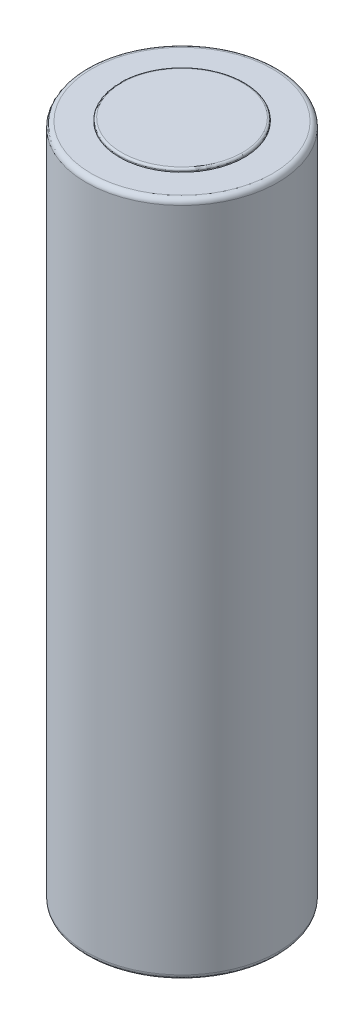
ISO-10303-21;
HEADER;
FILE_DESCRIPTION(('STEP AP214'),'2;1');
FILE_NAME('part.step','',(''),(''),'','','');
FILE_SCHEMA(('AUTOMOTIVE_DESIGN { 1 0 10303 214 1 1 1 1 }'));
ENDSEC;
DATA;
#1=APPLICATION_CONTEXT('core data for automotive mechanical design processes');
#2=APPLICATION_PROTOCOL_DEFINITION('international standard','automotive_design',2000,#1);
#3=PRODUCT_CONTEXT('',#1,'mechanical');
#4=PRODUCT('Part','Part','',(#3));
#5=PRODUCT_RELATED_PRODUCT_CATEGORY('part','',(#4));
#6=PRODUCT_DEFINITION_FORMATION('','',#4);
#7=PRODUCT_DEFINITION_CONTEXT('part definition',#1,'design');
#8=PRODUCT_DEFINITION('design','',#6,#7);
#9=PRODUCT_DEFINITION_SHAPE('','',#8);
#10=(LENGTH_UNIT() NAMED_UNIT(*) SI_UNIT(.MILLI.,.METRE.));
#11=(NAMED_UNIT(*) PLANE_ANGLE_UNIT() SI_UNIT($,.RADIAN.));
#12=(NAMED_UNIT(*) SI_UNIT($,.STERADIAN.) SOLID_ANGLE_UNIT());
#13=UNCERTAINTY_MEASURE_WITH_UNIT(LENGTH_MEASURE(1.E-05),#10,'distance_accuracy_value','');
#14=(GEOMETRIC_REPRESENTATION_CONTEXT(3) GLOBAL_UNCERTAINTY_ASSIGNED_CONTEXT((#13)) GLOBAL_UNIT_ASSIGNED_CONTEXT((#10,
#11,#12)) REPRESENTATION_CONTEXT('',''));
#15=CARTESIAN_POINT('',(0.,0.,0.));
#16=DIRECTION('',(0.,0.,1.));
#17=DIRECTION('',(1.,0.,0.));
#18=AXIS2_PLACEMENT_3D('',#15,#16,#17);
#19=CARTESIAN_POINT('',(0.,65.3,0.));
#20=DIRECTION('',(0.,1.,0.));
#21=DIRECTION('',(0.,0.,1.));
#22=AXIS2_PLACEMENT_3D('',#19,#20,#21);
#23=PLANE('',#22);
#24=DIRECTION('',(-0.00900695784269016,0.,0.999959436532513));
#25=VECTOR('',#24,1.);
#26=CARTESIAN_POINT('',(-5.79906075698834,65.3,-0.104476505490733));
#27=LINE('',#26,#25);
#28=CARTESIAN_POINT('',(-5.80000126744847,65.2999999999981,0.));
#29=VERTEX_POINT('',#28);
#30=CARTESIAN_POINT('',(-5.79906006301955,65.2999999999979,-0.104476492958051));
#31=VERTEX_POINT('',#30);
#32=EDGE_CURVE('E142',#29,#31,#27,.F.);
#33=ORIENTED_EDGE('',*,*,#32,.F.);
#34=CARTESIAN_POINT('',(0.,65.2999999999994,0.));
#35=DIRECTION('',(0.,-1.,0.));
#36=DIRECTION('',(0.999837749420466,0.,0.0180131849992303));
#37=AXIS2_PLACEMENT_3D('',#34,#35,#36);
#38=CIRCLE('',#37,5.80000045265931);
#39=CARTESIAN_POINT('',(5.79905930870916,65.2999999999998,0.104476479338248));
#40=VERTEX_POINT('',#39);
#41=EDGE_CURVE('E288',#40,#29,#38,.T.);
#42=ORIENTED_EDGE('',*,*,#41,.F.);
#43=DIRECTION('',(0.00900695782714143,0.,-0.999959436532653));
#44=VECTOR('',#43,1.);
#45=CARTESIAN_POINT('',(5.79905894664043,65.3,0.10447647269492));
#46=LINE('',#45,#44);
#47=CARTESIAN_POINT('',(5.80000018105904,65.2999999999997,0.));
#48=VERTEX_POINT('',#47);
#49=EDGE_CURVE('E133',#48,#40,#46,.F.);
#50=ORIENTED_EDGE('',*,*,#49,.F.);
#51=CARTESIAN_POINT('',(-5.79905967077754,65.2999999999987,-0.104476485741052));
#52=CARTESIAN_POINT('',(-5.73785876237762,65.2999999999987,-3.50148699197638));
#53=CARTESIAN_POINT('',(-3.29253402026648,65.2999999999987,-5.86026057930543));
#54=CARTESIAN_POINT('',(0.104476485966465,65.2999999999987,-5.79905967077347));
#55=CARTESIAN_POINT('',(3.50148699219941,65.2999999999987,-5.73785876224152));
#56=CARTESIAN_POINT('',(5.86026057943342,65.2999999999987,-3.29253402003869));
#57=CARTESIAN_POINT('',(5.79905967076941,65.2999999999987,0.104476486191878));
#58=(BOUNDED_CURVE() B_SPLINE_CURVE(3,(#51,#52,#53,#54,#55,#56,#57),.UNSPECIFIED.,.F.,
.F.) B_SPLINE_CURVE_WITH_KNOTS((4,3,4),(0.,0.5,1.),
.UNSPECIFIED.) CURVE() GEOMETRIC_REPRESENTATION_ITEM() RATIONAL_B_SPLINE_CURVE((0.999998500032184,
0.804736647034322,0.804736647034322,0.999998500032184,0.804736647034322,0.804736647034322,0.999998500032184)) REPRESENTATION_ITEM(''));
#59=EDGE_CURVE('E136',#31,#48,#58,.T.);
#60=ORIENTED_EDGE('',*,*,#59,.F.);
#61=EDGE_LOOP('',(#33,#42,#50,#60));
#62=FACE_BOUND('',#61,.T.);
#63=ADVANCED_FACE('F17',(#62),#23,.T.);
#64=CARTESIAN_POINT('',(5.79845904398635,65.3,0.104465665234797));
#65=CARTESIAN_POINT('',(5.85965361388045,65.3,-3.29219300197216));
#66=CARTESIAN_POINT('',(3.50112433221874,65.3,-5.73726447422833));
#67=CARTESIAN_POINT('',(0.104465665009407,65.3,-5.79845904399041));
#68=CARTESIAN_POINT('',(-3.29219300219993,65.3,-5.85965361375248));
#69=CARTESIAN_POINT('',(-5.73726447436442,65.3,-3.50112433199573));
#70=CARTESIAN_POINT('',(-5.79845904399447,65.3,-0.104465664784017));
#71=CARTESIAN_POINT('',(5.79865901153623,65.3,0.104469267871802));
#72=CARTESIAN_POINT('',(5.85985569180623,65.3,-3.29230653761385));
#73=CARTESIAN_POINT('',(3.50124507313443,65.3,-5.73746233140232));
#74=CARTESIAN_POINT('',(0.104469267646404,65.3,-5.79865901154029));
#75=CARTESIAN_POINT('',(-3.29230653784162,65.3,-5.85985569167826));
#76=CARTESIAN_POINT('',(-5.73746233153842,65.3,-3.50124507291141));
#77=CARTESIAN_POINT('',(-5.79865901154435,65.3,-0.104469267421007));
#78=CARTESIAN_POINT('',(5.79885897908611,65.3,0.104472870508807));
#79=CARTESIAN_POINT('',(5.86005776973201,65.3,-3.29242007325553));
#80=CARTESIAN_POINT('',(3.50136581405012,65.3,-5.73766018857632));
#81=CARTESIAN_POINT('',(0.104472870283402,65.3,-5.79885897909018));
#82=CARTESIAN_POINT('',(-3.29242007348332,65.3,-5.86005776960403));
#83=CARTESIAN_POINT('',(-5.73766018871242,65.3,-3.50136581382709));
#84=CARTESIAN_POINT('',(-5.79885897909424,65.3,-0.104472870057996));
#85=CARTESIAN_POINT('',(5.799058946636,65.3,0.104476473145812));
#86=CARTESIAN_POINT('',(5.86025984765779,65.3,-3.29253360889722));
#87=CARTESIAN_POINT('',(3.50148655496581,65.3,-5.73785804575031));
#88=CARTESIAN_POINT('',(0.104476472920399,65.3,-5.79905894664006));
#89=CARTESIAN_POINT('',(-3.29253360912501,65.3,-5.86025984752981));
#90=CARTESIAN_POINT('',(-5.73785804588641,65.3,-3.50148655474278));
#91=CARTESIAN_POINT('',(-5.79905894664412,65.3,-0.104476472694986));
#92=CARTESIAN_POINT('',(5.91619722532352,65.3,0.10658684904305));
#93=CARTESIAN_POINT('',(5.97863435592426,65.3,-3.35904124798421));
#94=CARTESIAN_POINT('',(3.57221494584277,65.3,-5.85376009486165));
#95=CARTESIAN_POINT('',(0.106586848813084,65.3,-5.91619722532767));
#96=CARTESIAN_POINT('',(-3.3590412482166,65.3,-5.97863435579369));
#97=CARTESIAN_POINT('',(-5.85376009500051,65.3,-3.57221494561523));
#98=CARTESIAN_POINT('',(-5.91619722533181,65.3,-0.106586848583118));
#99=CARTESIAN_POINT('',(5.99902649652,65.2171572875254,0.10807911015084));
#100=CARTESIAN_POINT('',(6.0623377734391,65.2171572875254,-3.40606925058333));
#101=CARTESIAN_POINT('',(3.62222747065429,65.2171572875254,-5.9357152197417));
#102=CARTESIAN_POINT('',(0.108079109917654,65.2171572875254,-5.9990264965242));
#103=CARTESIAN_POINT('',(-3.40606925081898,65.2171572875254,-6.0623377733067));
#104=CARTESIAN_POINT('',(-5.9357152198825,65.2171572875254,-3.62222747042356));
#105=CARTESIAN_POINT('',(-5.9990264965284,65.2171572875254,-0.108079109684468));
#106=CARTESIAN_POINT('',(5.99902649652,65.1,0.10807911015084));
#107=CARTESIAN_POINT('',(6.0623377734391,65.1,-3.40606925058333));
#108=CARTESIAN_POINT('',(3.62222747065429,65.1,-5.9357152197417));
#109=CARTESIAN_POINT('',(0.108079109917654,65.1,-5.9990264965242));
#110=CARTESIAN_POINT('',(-3.40606925081898,65.1,-6.0623377733067));
#111=CARTESIAN_POINT('',(-5.9357152198825,65.1,-3.62222747042356));
#112=CARTESIAN_POINT('',(-5.9990264965284,65.1,-0.108079109684468));
#113=(BOUNDED_SURFACE() B_SPLINE_SURFACE(3,3,((#64,#65,#66,#67,#68,#69,#70),(#71,#72,#73,#74,
#75,#76,#77),(#78,#79,#80,#81,#82,#83,#84),(#85,#86,#87,#88,#89,#90,#91),(#92,#93,#94,#95,#96,
#97,#98),(#99,#100,#101,#102,#103,#104,#105),(#106,#107,#108,#109,#110,#111,#112)),
.UNSPECIFIED.,.F.,.F.,.F.) B_SPLINE_SURFACE_WITH_KNOTS((4,3,4),(4,3,4),(-0.00212132034355967,0.,
1.),(0.,0.5,1.),.UNSPECIFIED.) GEOMETRIC_REPRESENTATION_ITEM() RATIONAL_B_SPLINE_SURFACE(((1.,
0.804737854115203,0.804737854115203,1.,0.804737854115203,0.804737854115203,1.),(1.,
0.804737854115203,0.804737854115203,1.,0.804737854115203,0.804737854115203,1.),(1.,
0.804737854115203,0.804737854115203,1.,0.804737854115203,0.804737854115203,1.),(1.,
0.804737854115203,0.804737854115203,1.,0.804737854115203,0.804737854115203,1.),
(0.804737854124364,0.647603013853314,0.647603013853314,0.804737854124364,0.647603013853314,
0.647603013853314,0.804737854124364),(0.804737854124364,0.647603013853314,0.647603013853314,
0.804737854124364,0.647603013853314,0.647603013853314,0.804737854124364),(1.,0.804737854115203,
0.804737854115203,1.,0.804737854115203,0.804737854115203,1.))) REPRESENTATION_ITEM('') SURFACE());
#114=CARTESIAN_POINT('',(5.79905894663873,65.1,0.104476472995537));
#115=DIRECTION('',(0.0180131849992303,0.,-0.999837749420466));
#116=DIRECTION('',(0.999837749420466,0.,0.0180131849992303));
#117=AXIS2_PLACEMENT_3D('',#114,#115,#116);
#118=CIRCLE('',#117,0.199999999999992);
#119=CARTESIAN_POINT('',(5.9990264965228,65.1,0.108079109995383));
#120=VERTEX_POINT('',#119);
#121=EDGE_CURVE('E135',#120,#40,#118,.F.);
#122=CARTESIAN_POINT('',(0.,65.1,0.));
#123=DIRECTION('',(0.,1.,0.));
#124=DIRECTION('',(0.,0.,1.));
#125=AXIS2_PLACEMENT_3D('',#122,#123,#124);
#126=CIRCLE('',#125,6.);
#127=CARTESIAN_POINT('',(-5.99902649652252,65.1,-0.10807911001093));
#128=VERTEX_POINT('',#127);
#129=EDGE_CURVE('E291',#128,#120,#126,.F.);
#130=CARTESIAN_POINT('',(-5.79905894664089,65.1,-0.104476472875316));
#131=DIRECTION('',(-0.0180131849785028,0.,0.99983774942084));
#132=DIRECTION('',(-0.99983774942084,0.,-0.0180131849785028));
#133=AXIS2_PLACEMENT_3D('',#130,#131,#132);
#134=CIRCLE('',#133,0.199999999999992);
#135=EDGE_CURVE('E139',#128,#31,#134,.F.);
#136=ORIENTED_EDGE('',*,*,#121,.F.);
#137=ORIENTED_EDGE('',*,*,#129,.F.);
#138=ORIENTED_EDGE('',*,*,#135,.T.);
#139=ORIENTED_EDGE('',*,*,#59,.T.);
#140=ORIENTED_EDGE('',*,*,#49,.T.);
#141=EDGE_LOOP('',(#136,#137,#138,#139,#140));
#142=FACE_BOUND('',#141,.T.);
#143=ADVANCED_FACE('F258',(#142),#113,.T.);
#144=CARTESIAN_POINT('',(0.,65.1,0.));
#145=DIRECTION('',(0.,1.,0.));
#146=DIRECTION('',(-1.,0.,0.));
#147=AXIS2_PLACEMENT_3D('',#144,#145,#146);
#148=TOROIDAL_SURFACE('',#147,5.80000000000002,0.199999999999992);
#149=ORIENTED_EDGE('',*,*,#121,.T.);
#150=ORIENTED_EDGE('',*,*,#41,.T.);
#151=ORIENTED_EDGE('',*,*,#32,.T.);
#152=ORIENTED_EDGE('',*,*,#135,.F.);
#153=CARTESIAN_POINT('',(0.,65.1,0.));
#154=DIRECTION('',(0.,1.,0.));
#155=DIRECTION('',(0.,0.,1.));
#156=AXIS2_PLACEMENT_3D('',#153,#154,#155);
#157=CIRCLE('',#156,6.);
#158=EDGE_CURVE('E132',#120,#128,#157,.F.);
#159=ORIENTED_EDGE('',*,*,#158,.F.);
#160=EDGE_LOOP('',(#149,#150,#151,#152,#159));
#161=FACE_BOUND('',#160,.T.);
#162=ADVANCED_FACE('F269',(#161),#148,.T.);
#163=CARTESIAN_POINT('',(0.,65.,0.));
#164=DIRECTION('',(0.,1.,0.));
#165=DIRECTION('',(0.,0.,1.));
#166=AXIS2_PLACEMENT_3D('',#163,#164,#165);
#167=CYLINDRICAL_SURFACE('',#166,6.);
#168=ORIENTED_EDGE('',*,*,#158,.T.);
#169=ORIENTED_EDGE('',*,*,#129,.T.);
#170=EDGE_LOOP('',(#168,#169));
#171=FACE_BOUND('',#170,.T.);
#172=CARTESIAN_POINT('',(0.,65.,0.));
#173=DIRECTION('',(0.,1.,0.));
#174=DIRECTION('',(0.,0.,1.));
#175=AXIS2_PLACEMENT_3D('',#172,#173,#174);
#176=CIRCLE('',#175,6.);
#177=CARTESIAN_POINT('',(0.,65.,6.));
#178=VERTEX_POINT('',#177);
#179=EDGE_CURVE('E129',#178,#178,#176,.F.);
#180=ORIENTED_EDGE('',*,*,#179,.F.);
#181=EDGE_LOOP('',(#180));
#182=FACE_BOUND('',#181,.T.);
#183=ADVANCED_FACE('F279',(#171,#182),#167,.T.);
#184=CARTESIAN_POINT('',(0.,65.,0.));
#185=DIRECTION('',(0.,1.,0.));
#186=DIRECTION('',(0.,0.,1.));
#187=AXIS2_PLACEMENT_3D('',#184,#185,#186);
#188=PLANE('',#187);
#189=ORIENTED_EDGE('',*,*,#179,.T.);
#190=EDGE_LOOP('',(#189));
#191=FACE_BOUND('',#190,.T.);
#192=CARTESIAN_POINT('',(0.,64.999999999976,0.));
#193=DIRECTION('',(0.,-1.,0.));
#194=DIRECTION('',(0.,0.,1.));
#195=AXIS2_PLACEMENT_3D('',#192,#193,#194);
#196=CIRCLE('',#195,8.70000490471975);
#197=CARTESIAN_POINT('',(3.80970830665952E-08,64.9999999999908,8.70000387573865));
#198=VERTEX_POINT('',#197);
#199=CARTESIAN_POINT('',(-8.70000122617994,64.999999999994,0.));
#200=VERTEX_POINT('',#199);
#201=EDGE_CURVE('E95',#198,#200,#196,.T.);
#202=ORIENTED_EDGE('',*,*,#201,.F.);
#203=CARTESIAN_POINT('',(0.,64.9999999999986,0.));
#204=DIRECTION('',(0.,-1.,0.));
#205=DIRECTION('',(0.999931526907525,0.,0.0117022004933182));
#206=AXIS2_PLACEMENT_3D('',#203,#204,#205);
#207=CIRCLE('',#206,8.70000118319305);
#208=CARTESIAN_POINT('',(8.69940487565148,64.9999999999997,0.101809151214847));
#209=VERTEX_POINT('',#208);
#210=EDGE_CURVE('E87',#209,#198,#207,.T.);
#211=ORIENTED_EDGE('',*,*,#210,.F.);
#212=DIRECTION('',(0.00585120040997278,0.,-0.999982881580361));
#213=VECTOR('',#212,1.);
#214=CARTESIAN_POINT('',(8.69940428409547,65.,0.101809144291866));
#215=LINE('',#214,#213);
#216=CARTESIAN_POINT('',(8.70000073711264,64.9999999999978,0.));
#217=VERTEX_POINT('',#216);
#218=EDGE_CURVE('E92',#217,#209,#215,.F.);
#219=ORIENTED_EDGE('',*,*,#218,.F.);
#220=CARTESIAN_POINT('',(0.,64.9999999999913,0.));
#221=DIRECTION('',(0.,-1.,0.));
#222=DIRECTION('',(0.,0.,-1.));
#223=AXIS2_PLACEMENT_3D('',#220,#221,#222);
#224=CIRCLE('',#223,8.70000294845053);
#225=CARTESIAN_POINT('',(-2.2103673053234E-12,64.9999999999975,-8.70000230055398));
#226=VERTEX_POINT('',#225);
#227=EDGE_CURVE('E104',#226,#217,#224,.T.);
#228=ORIENTED_EDGE('',*,*,#227,.F.);
#229=CARTESIAN_POINT('',(0.,64.9999999999986,0.));
#230=DIRECTION('',(0.,-1.,0.));
#231=DIRECTION('',(-0.999931526907525,0.,-0.0117022004933179));
#232=AXIS2_PLACEMENT_3D('',#229,#230,#231);
#233=CIRCLE('',#232,8.70000118319304);
#234=CARTESIAN_POINT('',(-8.69940487565148,64.9999999999997,-0.101809151214849));
#235=VERTEX_POINT('',#234);
#236=EDGE_CURVE('E121',#235,#226,#233,.T.);
#237=ORIENTED_EDGE('',*,*,#236,.F.);
#238=DIRECTION('',(-0.00585120040997288,0.,0.999982881580361));
#239=VECTOR('',#238,1.);
#240=CARTESIAN_POINT('',(-8.69940428409547,65.,-0.101809144291868));
#241=LINE('',#240,#239);
#242=EDGE_CURVE('E124',#200,#235,#241,.F.);
#243=ORIENTED_EDGE('',*,*,#242,.F.);
#244=EDGE_LOOP('',(#202,#211,#219,#228,#237,#243));
#245=FACE_BOUND('',#244,.T.);
#246=ADVANCED_FACE('F90',(#191,#245),#188,.T.);
#247=CARTESIAN_POINT('',(0.,0.,0.));
#248=DIRECTION('',(0.,1.,0.));
#249=DIRECTION('',(0.,0.,1.));
#250=AXIS2_PLACEMENT_3D('',#247,#248,#249);
#251=PLANE('',#250);
#252=DIRECTION('',(0.00829880106201944,0.,0.99996556435756));
#253=VECTOR('',#252,1.);
#254=CARTESIAN_POINT('',(8.69879976758981,0.,-0.144622225249996));
#255=LINE('',#254,#253);
#256=CARTESIAN_POINT('',(8.70000037913149,5.74915181246574E-13,0.));
#257=VERTEX_POINT('',#256);
#258=CARTESIAN_POINT('',(8.6987989778346,7.48478969776792E-13,-0.14462221217927));
#259=VERTEX_POINT('',#258);
#260=EDGE_CURVE('E119',#257,#259,#255,.F.);
#261=ORIENTED_EDGE('',*,*,#260,.F.);
#262=CARTESIAN_POINT('',(-8.69879938850424,2.299769145195E-12,0.144622219125641));
#263=CARTESIAN_POINT('',(-8.61408165395955,2.299769145195E-12,5.24026092463135));
#264=CARTESIAN_POINT('',(-4.95101648620025,2.299769145195E-12,8.78351712315028));
#265=CARTESIAN_POINT('',(0.144622219303726,2.299769145195E-12,8.69879938850128));
#266=CARTESIAN_POINT('',(5.2402609248077,2.299769145195E-12,8.61408165385227));
#267=CARTESIAN_POINT('',(8.78351712325164,2.299769145195E-12,4.95101648602043));
#268=CARTESIAN_POINT('',(8.69879938849832,2.299769145195E-12,-0.144622219481812));
#269=(BOUNDED_CURVE() B_SPLINE_CURVE(3,(#262,#263,#264,#265,#266,#267,#268),.UNSPECIFIED.,.F.,
.F.) B_SPLINE_CURVE_WITH_KNOTS((4,3,4),(0.,0.5,1.),
.UNSPECIFIED.) CURVE() GEOMETRIC_REPRESENTATION_ITEM() RATIONAL_B_SPLINE_CURVE((0.999998743664984,
0.804736843099194,0.804736843099194,0.999998743664984,0.804736843099194,0.804736843099194,0.999998743664984)) REPRESENTATION_ITEM(''));
#270=CARTESIAN_POINT('',(-8.69879863034177,7.66445585556623E-13,0.144622206520779));
#271=VERTEX_POINT('',#270);
#272=EDGE_CURVE('E99',#271,#257,#269,.T.);
#273=ORIENTED_EDGE('',*,*,#272,.F.);
#274=DIRECTION('',(-0.00831190747068184,0.,-0.999965455500438));
#275=VECTOR('',#274,1.);
#276=CARTESIAN_POINT('',(-8.69879787217906,0.,0.144622193915913));
#277=LINE('',#276,#275);
#278=CARTESIAN_POINT('',(-8.70000047391743,8.98180184741304E-13,0.));
#279=VERTEX_POINT('',#278);
#280=EDGE_CURVE('E107',#279,#271,#277,.F.);
#281=ORIENTED_EDGE('',*,*,#280,.F.);
#282=CARTESIAN_POINT('',(0.,3.59315441983421E-12,0.));
#283=DIRECTION('',(0.,1.,0.));
#284=DIRECTION('',(0.999861824388398,0.,-0.0166232406799897));
#285=AXIS2_PLACEMENT_3D('',#282,#283,#284);
#286=CIRCLE('',#285,8.70000189566973);
#287=EDGE_CURVE('E116',#259,#279,#286,.T.);
#288=ORIENTED_EDGE('',*,*,#287,.F.);
#289=EDGE_LOOP('',(#261,#273,#281,#288));
#290=FACE_BOUND('',#289,.T.);
#291=ADVANCED_FACE('F192',(#290),#251,.F.);
#292=CARTESIAN_POINT('',(0.,0.5,0.));
#293=DIRECTION('',(0.,1.,0.));
#294=DIRECTION('',(0.,0.,1.));
#295=AXIS2_PLACEMENT_3D('',#292,#293,#294);
#296=TOROIDAL_SURFACE('',#295,8.7,0.5);
#297=ORIENTED_EDGE('',*,*,#287,.T.);
#298=ORIENTED_EDGE('',*,*,#280,.T.);
#299=CARTESIAN_POINT('',(-8.69879787217906,0.5,0.144622193915912));
#300=DIRECTION('',(0.0166232406799902,0.,0.999861824388398));
#301=DIRECTION('',(-0.999861824388398,0.,0.0166232406799902));
#302=AXIS2_PLACEMENT_3D('',#299,#300,#301);
#303=CIRCLE('',#302,0.5);
#304=CARTESIAN_POINT('',(-9.19872878437091,0.5,0.152933814397149));
#305=VERTEX_POINT('',#304);
#306=EDGE_CURVE('E178',#305,#271,#303,.T.);
#307=ORIENTED_EDGE('',*,*,#306,.F.);
#308=CARTESIAN_POINT('',(0.,0.5,0.));
#309=DIRECTION('',(0.,1.,0.));
#310=DIRECTION('',(0.,0.,1.));
#311=AXIS2_PLACEMENT_3D('',#308,#309,#310);
#312=CIRCLE('',#311,9.2);
#313=CARTESIAN_POINT('',(9.1987287843717,0.5,-0.152933814350069));
#314=VERTEX_POINT('',#313);
#315=EDGE_CURVE('E37',#314,#305,#312,.T.);
#316=ORIENTED_EDGE('',*,*,#315,.F.);
#317=CARTESIAN_POINT('',(8.69879787217906,0.5,-0.144622193915912));
#318=DIRECTION('',(-0.0166232406799897,0.,-0.999861824388398));
#319=DIRECTION('',(0.999861824388398,0.,-0.0166232406799897));
#320=AXIS2_PLACEMENT_3D('',#317,#318,#319);
#321=CIRCLE('',#320,0.5);
#322=EDGE_CURVE('E248',#259,#314,#321,.F.);
#323=ORIENTED_EDGE('',*,*,#322,.F.);
#324=EDGE_LOOP('',(#297,#298,#307,#316,#323));
#325=FACE_BOUND('',#324,.T.);
#326=ADVANCED_FACE('F162',(#325),#296,.T.);
#327=CARTESIAN_POINT('',(0.,64.5,0.));
#328=DIRECTION('',(0.,1.,0.));
#329=DIRECTION('',(0.,0.,1.));
#330=AXIS2_PLACEMENT_3D('',#327,#328,#329);
#331=TOROIDAL_SURFACE('',#330,8.69999999999998,0.500000000000012);
#332=ORIENTED_EDGE('',*,*,#236,.T.);
#333=ORIENTED_EDGE('',*,*,#227,.T.);
#334=ORIENTED_EDGE('',*,*,#218,.T.);
#335=ORIENTED_EDGE('',*,*,#210,.T.);
#336=ORIENTED_EDGE('',*,*,#201,.T.);
#337=ORIENTED_EDGE('',*,*,#242,.T.);
#338=EDGE_LOOP('',(#332,#333,#334,#335,#336,#337));
#339=FACE_BOUND('',#338,.T.);
#340=CARTESIAN_POINT('',(0.,64.5,0.));
#341=DIRECTION('',(0.,1.,0.));
#342=DIRECTION('',(0.,0.,1.));
#343=AXIS2_PLACEMENT_3D('',#340,#341,#342);
#344=CIRCLE('',#343,9.2);
#345=CARTESIAN_POINT('',(0.,64.5,9.2));
#346=VERTEX_POINT('',#345);
#347=EDGE_CURVE('E29',#346,#346,#344,.F.);
#348=ORIENTED_EDGE('',*,*,#347,.F.);
#349=EDGE_LOOP('',(#348));
#350=FACE_BOUND('',#349,.T.);
#351=ADVANCED_FACE('F102',(#339,#350),#331,.T.);
#352=CARTESIAN_POINT('',(-9.19872878437326,0.5,0.152933814255914));
#353=CARTESIAN_POINT('',(-9.10914223012614,0.5,5.54142437963747));
#354=CARTESIAN_POINT('',(-5.23555675093548,0.5,9.28831533872757));
#355=CARTESIAN_POINT('',(0.152933814444235,0.5,9.19872878437013));
#356=CARTESIAN_POINT('',(5.54142437982395,0.5,9.10914223001269));
#357=CARTESIAN_POINT('',(9.28831533883475,0.5,5.23555675074533));
#358=CARTESIAN_POINT('',(9.198728784367,0.5,-0.152933814632555));
#359=CARTESIAN_POINT('',(-9.19872878437326,0.207106781186547,0.152933814255914));
#360=CARTESIAN_POINT('',(-9.10914223012614,0.207106781186547,5.54142437963747));
#361=CARTESIAN_POINT('',(-5.23555675093549,0.207106781186547,9.28831533872757));
#362=CARTESIAN_POINT('',(0.152933814444235,0.207106781186547,9.19872878437013));
#363=CARTESIAN_POINT('',(5.54142437982395,0.207106781186547,9.10914223001269));
#364=CARTESIAN_POINT('',(9.28831533883475,0.207106781186547,5.23555675074533));
#365=CARTESIAN_POINT('',(9.198728784367,0.207106781186547,-0.152933814632555));
#366=CARTESIAN_POINT('',(-8.99165062029287,0.,0.149491028385792));
#367=CARTESIAN_POINT('',(-8.90408080331615,0.,5.4166780137184));
#368=CARTESIAN_POINT('',(-5.11769595676094,0.,9.07922043737436));
#369=CARTESIAN_POINT('',(0.149491028569873,0.,8.99165062028981));
#370=CARTESIAN_POINT('',(5.41667801390069,0.,8.90408080320526));
#371=CARTESIAN_POINT('',(9.07922043747913,0.,5.11769595657507));
#372=CARTESIAN_POINT('',(8.99165062028675,0.,-0.149491028753954));
#373=CARTESIAN_POINT('',(-8.69879787217906,0.,0.144622193915919));
#374=CARTESIAN_POINT('',(-8.61408015240189,0.,5.24026001117891));
#375=CARTESIAN_POINT('',(-4.95101562316725,0.,8.78351559205759));
#376=CARTESIAN_POINT('',(0.144622194094005,0.,8.6987978721761));
#377=CARTESIAN_POINT('',(5.24026001135526,0.,8.61408015229461));
#378=CARTESIAN_POINT('',(8.78351559215895,0.,4.95101562298743));
#379=CARTESIAN_POINT('',(8.69879787217314,0.,-0.14462219427209));
#380=CARTESIAN_POINT('',(-8.69859789981418,0.,0.144618869267783));
#381=CARTESIAN_POINT('',(-8.6138821275708,0.,5.24013954543152));
#382=CARTESIAN_POINT('',(-4.95090180671614,0.,8.78331367215892));
#383=CARTESIAN_POINT('',(0.144618869445865,0.,8.69859789981122));
#384=CARTESIAN_POINT('',(5.24013954560787,0.,8.61388212746352));
#385=CARTESIAN_POINT('',(8.78331367226028,0.,4.95090180653633));
#386=CARTESIAN_POINT('',(8.69859789980826,0.,-0.144618869623946));
#387=CARTESIAN_POINT('',(-8.69839792744931,0.,0.144615544619647));
#388=CARTESIAN_POINT('',(-8.61368410273972,0.,5.24001907968414));
#389=CARTESIAN_POINT('',(-4.95078799026504,0.,8.78311175226026));
#390=CARTESIAN_POINT('',(0.144615544797724,0.,8.69839792744635));
#391=CARTESIAN_POINT('',(5.24001907986048,0.,8.61368410263244));
#392=CARTESIAN_POINT('',(8.78311175236161,0.,4.95078799008522));
#393=CARTESIAN_POINT('',(8.69839792744338,0.,-0.144615544975802));
#394=CARTESIAN_POINT('',(-8.69819795508443,0.,0.144612219971511));
#395=CARTESIAN_POINT('',(-8.61348607790863,0.,5.23989861393676));
#396=CARTESIAN_POINT('',(-4.95067417381393,0.,8.78290983236159));
#397=CARTESIAN_POINT('',(0.144612220149584,0.,8.69819795508147));
#398=CARTESIAN_POINT('',(5.2398986141131,0.,8.61348607780135));
#399=CARTESIAN_POINT('',(8.78290983246294,0.,4.95067417363412));
#400=CARTESIAN_POINT('',(8.69819795507851,0.,-0.144612220327658));
#401=(BOUNDED_SURFACE() B_SPLINE_SURFACE(3,3,((#352,#353,#354,#355,#356,#357,#358),(#359,#360,
#361,#362,#363,#364,#365),(#366,#367,#368,#369,#370,#371,#372),(#373,#374,#375,#376,#377,#378,
#379),(#380,#381,#382,#383,#384,#385,#386),(#387,#388,#389,#390,#391,#392,#393),(#394,#395,#396,
#397,#398,#399,#400)),.UNSPECIFIED.,.F.,.F.,.F.) B_SPLINE_SURFACE_WITH_KNOTS((4,3,4),(4,3,4),
(0.,1.,1.00084852813742),(0.,0.5,1.),
.UNSPECIFIED.) GEOMETRIC_REPRESENTATION_ITEM() RATIONAL_B_SPLINE_SURFACE(((1.,0.804737854119539,
0.804737854119539,1.,0.804737854119539,0.804737854119539,1.),(0.804737854124365,
0.647603013856804,0.647603013856804,0.804737854124365,0.647603013856804,0.647603013856804,
0.804737854124365),(0.804737854124365,0.647603013856804,0.647603013856804,0.804737854124365,
0.647603013856804,0.647603013856804,0.804737854124365),(1.,0.804737854119539,0.804737854119539,
1.,0.804737854119539,0.804737854119539,1.),(1.,0.804737854119539,0.804737854119539,1.,
0.804737854119539,0.804737854119539,1.),(1.,0.804737854119539,0.804737854119539,1.,
0.804737854119539,0.804737854119539,1.),(1.,0.804737854119539,0.804737854119539,1.,
0.804737854119539,0.804737854119539,1.))) REPRESENTATION_ITEM('') SURFACE());
#402=CARTESIAN_POINT('',(0.,0.5,0.));
#403=DIRECTION('',(0.,1.,0.));
#404=DIRECTION('',(0.,0.,1.));
#405=AXIS2_PLACEMENT_3D('',#402,#403,#404);
#406=CIRCLE('',#405,9.2);
#407=EDGE_CURVE('E11',#305,#314,#406,.T.);
#408=ORIENTED_EDGE('',*,*,#407,.F.);
#409=ORIENTED_EDGE('',*,*,#306,.T.);
#410=ORIENTED_EDGE('',*,*,#272,.T.);
#411=ORIENTED_EDGE('',*,*,#260,.T.);
#412=ORIENTED_EDGE('',*,*,#322,.T.);
#413=EDGE_LOOP('',(#408,#409,#410,#411,#412));
#414=FACE_BOUND('',#413,.T.);
#415=ADVANCED_FACE('F161',(#414),#401,.T.);
#416=CARTESIAN_POINT('',(0.,0.,0.));
#417=DIRECTION('',(0.,1.,0.));
#418=DIRECTION('',(0.,0.,1.));
#419=AXIS2_PLACEMENT_3D('',#416,#417,#418);
#420=CYLINDRICAL_SURFACE('',#419,9.2);
#421=ORIENTED_EDGE('',*,*,#347,.T.);
#422=EDGE_LOOP('',(#421));
#423=FACE_BOUND('',#422,.T.);
#424=ORIENTED_EDGE('',*,*,#315,.T.);
#425=ORIENTED_EDGE('',*,*,#407,.T.);
#426=EDGE_LOOP('',(#424,#425));
#427=FACE_BOUND('',#426,.T.);
#428=ADVANCED_FACE('F333',(#423,#427),#420,.T.);
#429=CLOSED_SHELL('',(#63,#143,#162,#183,#246,#291,#326,#351,#415,#428));
#430=MANIFOLD_SOLID_BREP('B1',#429);
#431=ADVANCED_BREP_SHAPE_REPRESENTATION('',(#18,#430),#14);
#432=SHAPE_DEFINITION_REPRESENTATION(#9,#431);
ENDSEC;
END-ISO-10303-21;
